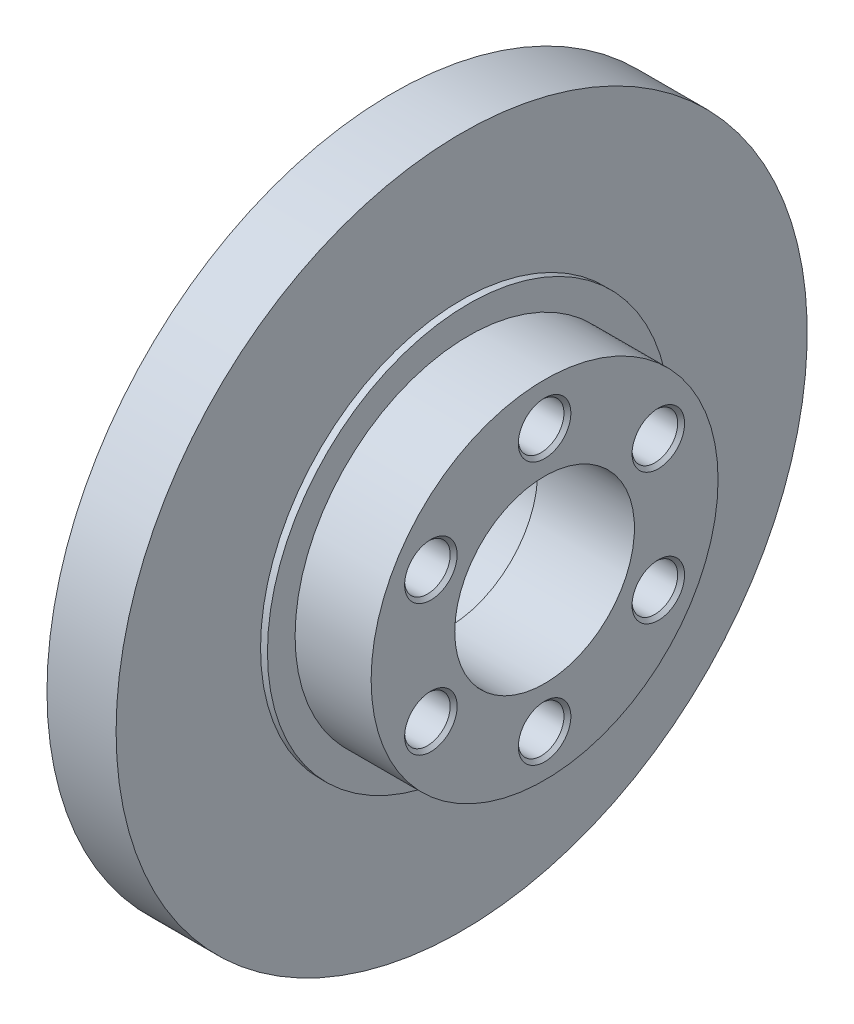
ISO-10303-21;
HEADER;
FILE_DESCRIPTION(('STEP AP214'),'2;1');
FILE_NAME('part.step','',(''),(''),'','','');
FILE_SCHEMA(('AUTOMOTIVE_DESIGN { 1 0 10303 214 1 1 1 1 }'));
ENDSEC;
DATA;
#1=APPLICATION_CONTEXT('core data for automotive mechanical design processes');
#2=APPLICATION_PROTOCOL_DEFINITION('international standard','automotive_design',2000,#1);
#3=PRODUCT_CONTEXT('',#1,'mechanical');
#4=PRODUCT('Part','Part','',(#3));
#5=PRODUCT_RELATED_PRODUCT_CATEGORY('part','',(#4));
#6=PRODUCT_DEFINITION_FORMATION('','',#4);
#7=PRODUCT_DEFINITION_CONTEXT('part definition',#1,'design');
#8=PRODUCT_DEFINITION('design','',#6,#7);
#9=PRODUCT_DEFINITION_SHAPE('','',#8);
#10=(LENGTH_UNIT() NAMED_UNIT(*) SI_UNIT(.MILLI.,.METRE.));
#11=(NAMED_UNIT(*) PLANE_ANGLE_UNIT() SI_UNIT($,.RADIAN.));
#12=(NAMED_UNIT(*) SI_UNIT($,.STERADIAN.) SOLID_ANGLE_UNIT());
#13=UNCERTAINTY_MEASURE_WITH_UNIT(LENGTH_MEASURE(1.E-05),#10,'distance_accuracy_value','');
#14=(GEOMETRIC_REPRESENTATION_CONTEXT(3) GLOBAL_UNCERTAINTY_ASSIGNED_CONTEXT((#13)) GLOBAL_UNIT_ASSIGNED_CONTEXT((#10,
#11,#12)) REPRESENTATION_CONTEXT('',''));
#15=CARTESIAN_POINT('',(0.,0.,0.));
#16=DIRECTION('',(0.,0.,1.));
#17=DIRECTION('',(1.,0.,0.));
#18=AXIS2_PLACEMENT_3D('',#15,#16,#17);
#19=CARTESIAN_POINT('',(0.,14.,0.));
#20=DIRECTION('',(1.,0.,0.));
#21=DIRECTION('',(0.,0.,-1.));
#22=AXIS2_PLACEMENT_3D('',#19,#20,#21);
#23=PLANE('',#22);
#24=CARTESIAN_POINT('',(0.,40.,0.));
#25=DIRECTION('',(1.,0.,0.));
#26=DIRECTION('',(0.,0.,-1.));
#27=AXIS2_PLACEMENT_3D('',#24,#25,#26);
#28=CIRCLE('',#27,2.5);
#29=CARTESIAN_POINT('',(0.,40.,-2.5));
#30=VERTEX_POINT('',#29);
#31=EDGE_CURVE('E158',#30,#30,#28,.T.);
#32=ORIENTED_EDGE('',*,*,#31,.T.);
#33=EDGE_LOOP('',(#32));
#34=FACE_BOUND('',#33,.T.);
#35=CARTESIAN_POINT('',(0.,28.2842712474619,-28.284271247462));
#36=DIRECTION('',(1.,0.,0.));
#37=DIRECTION('',(0.,0.,-1.));
#38=AXIS2_PLACEMENT_3D('',#35,#36,#37);
#39=CIRCLE('',#38,2.5);
#40=CARTESIAN_POINT('',(0.,28.2842712474619,-30.784271247462));
#41=VERTEX_POINT('',#40);
#42=EDGE_CURVE('E155',#41,#41,#39,.T.);
#43=ORIENTED_EDGE('',*,*,#42,.T.);
#44=EDGE_LOOP('',(#43));
#45=FACE_BOUND('',#44,.T.);
#46=CARTESIAN_POINT('',(0.,-1.39659253553725E-13,-40.));
#47=DIRECTION('',(1.,0.,0.));
#48=DIRECTION('',(0.,0.,-1.));
#49=AXIS2_PLACEMENT_3D('',#46,#47,#48);
#50=CIRCLE('',#49,2.5);
#51=CARTESIAN_POINT('',(0.,-1.39659253553725E-13,-42.5));
#52=VERTEX_POINT('',#51);
#53=EDGE_CURVE('E149',#52,#52,#50,.T.);
#54=ORIENTED_EDGE('',*,*,#53,.T.);
#55=EDGE_LOOP('',(#54));
#56=FACE_BOUND('',#55,.T.);
#57=CARTESIAN_POINT('',(0.,-28.2842712474621,-28.2842712474618));
#58=DIRECTION('',(1.,0.,0.));
#59=DIRECTION('',(0.,0.,-1.));
#60=AXIS2_PLACEMENT_3D('',#57,#58,#59);
#61=CIRCLE('',#60,2.5);
#62=CARTESIAN_POINT('',(0.,-28.2842712474621,-30.7842712474617));
#63=VERTEX_POINT('',#62);
#64=EDGE_CURVE('E143',#63,#63,#61,.T.);
#65=ORIENTED_EDGE('',*,*,#64,.T.);
#66=EDGE_LOOP('',(#65));
#67=FACE_BOUND('',#66,.T.);
#68=CARTESIAN_POINT('',(0.,-40.,2.79318507107451E-13));
#69=DIRECTION('',(1.,0.,0.));
#70=DIRECTION('',(0.,0.,-1.));
#71=AXIS2_PLACEMENT_3D('',#68,#69,#70);
#72=CIRCLE('',#71,2.5);
#73=CARTESIAN_POINT('',(0.,-40.,-2.49999999999972));
#74=VERTEX_POINT('',#73);
#75=EDGE_CURVE('E137',#74,#74,#72,.T.);
#76=ORIENTED_EDGE('',*,*,#75,.T.);
#77=EDGE_LOOP('',(#76));
#78=FACE_BOUND('',#77,.T.);
#79=CARTESIAN_POINT('',(0.,-28.2842712474617,28.2842712474621));
#80=DIRECTION('',(1.,0.,0.));
#81=DIRECTION('',(0.,0.,-1.));
#82=AXIS2_PLACEMENT_3D('',#79,#80,#81);
#83=CIRCLE('',#82,2.5);
#84=CARTESIAN_POINT('',(0.,-28.2842712474617,25.7842712474622));
#85=VERTEX_POINT('',#84);
#86=EDGE_CURVE('E131',#85,#85,#83,.T.);
#87=ORIENTED_EDGE('',*,*,#86,.T.);
#88=EDGE_LOOP('',(#87));
#89=FACE_BOUND('',#88,.T.);
#90=CARTESIAN_POINT('',(0.,4.18977760661176E-13,40.));
#91=DIRECTION('',(1.,0.,0.));
#92=DIRECTION('',(0.,0.,-1.));
#93=AXIS2_PLACEMENT_3D('',#90,#91,#92);
#94=CIRCLE('',#93,2.5);
#95=CARTESIAN_POINT('',(0.,4.18977760661176E-13,37.5));
#96=VERTEX_POINT('',#95);
#97=EDGE_CURVE('E125',#96,#96,#94,.T.);
#98=ORIENTED_EDGE('',*,*,#97,.T.);
#99=EDGE_LOOP('',(#98));
#100=FACE_BOUND('',#99,.T.);
#101=CARTESIAN_POINT('',(0.,28.2842712474622,28.2842712474616));
#102=DIRECTION('',(1.,0.,0.));
#103=DIRECTION('',(0.,0.,-1.));
#104=AXIS2_PLACEMENT_3D('',#101,#102,#103);
#105=CIRCLE('',#104,2.5);
#106=CARTESIAN_POINT('',(0.,28.2842712474622,25.7842712474616));
#107=VERTEX_POINT('',#106);
#108=EDGE_CURVE('E118',#107,#107,#105,.T.);
#109=ORIENTED_EDGE('',*,*,#108,.T.);
#110=EDGE_LOOP('',(#109));
#111=FACE_BOUND('',#110,.T.);
#112=CARTESIAN_POINT('',(0.,0.,0.));
#113=DIRECTION('',(-1.,0.,0.));
#114=DIRECTION('',(0.,0.,1.));
#115=AXIS2_PLACEMENT_3D('',#112,#113,#114);
#116=CIRCLE('',#115,14.);
#117=CARTESIAN_POINT('',(0.,0.,14.));
#118=VERTEX_POINT('',#117);
#119=EDGE_CURVE('E111',#118,#118,#116,.T.);
#120=ORIENTED_EDGE('',*,*,#119,.F.);
#121=EDGE_LOOP('',(#120));
#122=FACE_BOUND('',#121,.T.);
#123=CARTESIAN_POINT('',(0.,0.,0.));
#124=DIRECTION('',(-1.,0.,0.));
#125=DIRECTION('',(0.,0.,1.));
#126=AXIS2_PLACEMENT_3D('',#123,#124,#125);
#127=CIRCLE('',#126,50.);
#128=CARTESIAN_POINT('',(0.,0.,50.));
#129=VERTEX_POINT('',#128);
#130=EDGE_CURVE('E84',#129,#129,#127,.T.);
#131=ORIENTED_EDGE('',*,*,#130,.T.);
#132=EDGE_LOOP('',(#131));
#133=FACE_BOUND('',#132,.T.);
#134=ADVANCED_FACE('F39',(#34,#45,#56,#67,#78,#89,#100,#111,#122,#133),#23,.F.);
#135=CARTESIAN_POINT('',(0.,0.,0.));
#136=DIRECTION('',(-1.,0.,0.));
#137=DIRECTION('',(0.,0.,1.));
#138=AXIS2_PLACEMENT_3D('',#135,#136,#137);
#139=CYLINDRICAL_SURFACE('',#138,50.);
#140=ORIENTED_EDGE('',*,*,#130,.F.);
#141=EDGE_LOOP('',(#140));
#142=FACE_BOUND('',#141,.T.);
#143=CARTESIAN_POINT('',(10.,0.,0.));
#144=DIRECTION('',(-1.,0.,0.));
#145=DIRECTION('',(0.,0.,1.));
#146=AXIS2_PLACEMENT_3D('',#143,#144,#145);
#147=CIRCLE('',#146,50.);
#148=CARTESIAN_POINT('',(10.,0.,50.));
#149=VERTEX_POINT('',#148);
#150=EDGE_CURVE('E87',#149,#149,#147,.T.);
#151=ORIENTED_EDGE('',*,*,#150,.T.);
#152=EDGE_LOOP('',(#151));
#153=FACE_BOUND('',#152,.T.);
#154=ADVANCED_FACE('F200',(#142,#153),#139,.T.);
#155=CARTESIAN_POINT('',(10.,50.,0.));
#156=DIRECTION('',(-1.,0.,0.));
#157=DIRECTION('',(0.,0.,1.));
#158=AXIS2_PLACEMENT_3D('',#155,#156,#157);
#159=PLANE('',#158);
#160=ORIENTED_EDGE('',*,*,#150,.F.);
#161=EDGE_LOOP('',(#160));
#162=FACE_BOUND('',#161,.T.);
#163=CARTESIAN_POINT('',(10.,0.,0.));
#164=DIRECTION('',(-1.,0.,0.));
#165=DIRECTION('',(0.,0.,1.));
#166=AXIS2_PLACEMENT_3D('',#163,#164,#165);
#167=CIRCLE('',#166,29.1);
#168=CARTESIAN_POINT('',(10.,0.,29.1));
#169=VERTEX_POINT('',#168);
#170=EDGE_CURVE('E90',#169,#169,#167,.T.);
#171=ORIENTED_EDGE('',*,*,#170,.T.);
#172=EDGE_LOOP('',(#171));
#173=FACE_BOUND('',#172,.T.);
#174=ADVANCED_FACE('F208',(#162,#173),#159,.F.);
#175=CARTESIAN_POINT('',(0.,0.,0.));
#176=DIRECTION('',(-1.,0.,0.));
#177=DIRECTION('',(0.,0.,1.));
#178=AXIS2_PLACEMENT_3D('',#175,#176,#177);
#179=CYLINDRICAL_SURFACE('',#178,29.1);
#180=ORIENTED_EDGE('',*,*,#170,.F.);
#181=EDGE_LOOP('',(#180));
#182=FACE_BOUND('',#181,.T.);
#183=CARTESIAN_POINT('',(11.,0.,0.));
#184=DIRECTION('',(-1.,0.,0.));
#185=DIRECTION('',(0.,0.,1.));
#186=AXIS2_PLACEMENT_3D('',#183,#184,#185);
#187=CIRCLE('',#186,29.1);
#188=CARTESIAN_POINT('',(11.,0.,29.1));
#189=VERTEX_POINT('',#188);
#190=EDGE_CURVE('E93',#189,#189,#187,.T.);
#191=ORIENTED_EDGE('',*,*,#190,.T.);
#192=EDGE_LOOP('',(#191));
#193=FACE_BOUND('',#192,.T.);
#194=ADVANCED_FACE('F289',(#182,#193),#179,.T.);
#195=CARTESIAN_POINT('',(11.,29.1,0.));
#196=DIRECTION('',(-1.,0.,0.));
#197=DIRECTION('',(0.,0.,1.));
#198=AXIS2_PLACEMENT_3D('',#195,#196,#197);
#199=PLANE('',#198);
#200=ORIENTED_EDGE('',*,*,#190,.F.);
#201=EDGE_LOOP('',(#200));
#202=FACE_BOUND('',#201,.T.);
#203=CARTESIAN_POINT('',(11.,0.,0.));
#204=DIRECTION('',(-1.,0.,0.));
#205=DIRECTION('',(0.,0.,1.));
#206=AXIS2_PLACEMENT_3D('',#203,#204,#205);
#207=CIRCLE('',#206,25.1);
#208=CARTESIAN_POINT('',(11.,0.,25.1));
#209=VERTEX_POINT('',#208);
#210=EDGE_CURVE('E96',#209,#209,#207,.T.);
#211=ORIENTED_EDGE('',*,*,#210,.T.);
#212=EDGE_LOOP('',(#211));
#213=FACE_BOUND('',#212,.T.);
#214=ADVANCED_FACE('F294',(#202,#213),#199,.F.);
#215=CARTESIAN_POINT('',(0.,0.,0.));
#216=DIRECTION('',(-1.,0.,0.));
#217=DIRECTION('',(0.,0.,1.));
#218=AXIS2_PLACEMENT_3D('',#215,#216,#217);
#219=CYLINDRICAL_SURFACE('',#218,25.1);
#220=ORIENTED_EDGE('',*,*,#210,.F.);
#221=EDGE_LOOP('',(#220));
#222=FACE_BOUND('',#221,.T.);
#223=CARTESIAN_POINT('',(22.,0.,0.));
#224=DIRECTION('',(-1.,0.,0.));
#225=DIRECTION('',(0.,0.,1.));
#226=AXIS2_PLACEMENT_3D('',#223,#224,#225);
#227=CIRCLE('',#226,25.1);
#228=CARTESIAN_POINT('',(22.,0.,25.1));
#229=VERTEX_POINT('',#228);
#230=EDGE_CURVE('E99',#229,#229,#227,.T.);
#231=ORIENTED_EDGE('',*,*,#230,.T.);
#232=EDGE_LOOP('',(#231));
#233=FACE_BOUND('',#232,.T.);
#234=ADVANCED_FACE('F256',(#222,#233),#219,.T.);
#235=CARTESIAN_POINT('',(22.,25.1,0.));
#236=DIRECTION('',(-1.,0.,0.));
#237=DIRECTION('',(0.,0.,1.));
#238=AXIS2_PLACEMENT_3D('',#235,#236,#237);
#239=PLANE('',#238);
#240=CARTESIAN_POINT('',(22.,9.50000000000019,16.4544826719042));
#241=DIRECTION('',(-1.,0.,0.));
#242=DIRECTION('',(0.,0.,1.));
#243=AXIS2_PLACEMENT_3D('',#240,#241,#242);
#244=CIRCLE('',#243,3.79999999999998);
#245=CARTESIAN_POINT('',(22.,9.50000000000019,20.2544826719042));
#246=VERTEX_POINT('',#245);
#247=EDGE_CURVE('E63',#246,#246,#244,.T.);
#248=ORIENTED_EDGE('',*,*,#247,.T.);
#249=EDGE_LOOP('',(#248));
#250=FACE_BOUND('',#249,.T.);
#251=CARTESIAN_POINT('',(22.,-9.49999999999985,16.4544826719044));
#252=DIRECTION('',(-1.,0.,0.));
#253=DIRECTION('',(0.,0.,1.));
#254=AXIS2_PLACEMENT_3D('',#251,#252,#253);
#255=CIRCLE('',#254,3.79999999999998);
#256=CARTESIAN_POINT('',(22.,-9.49999999999985,20.2544826719044));
#257=VERTEX_POINT('',#256);
#258=EDGE_CURVE('E66',#257,#257,#255,.T.);
#259=ORIENTED_EDGE('',*,*,#258,.T.);
#260=EDGE_LOOP('',(#259));
#261=FACE_BOUND('',#260,.T.);
#262=CARTESIAN_POINT('',(22.,-19.,1.32676290876039E-13));
#263=DIRECTION('',(-1.,0.,0.));
#264=DIRECTION('',(0.,0.,1.));
#265=AXIS2_PLACEMENT_3D('',#262,#263,#264);
#266=CIRCLE('',#265,3.8);
#267=CARTESIAN_POINT('',(22.,-19.,3.80000000000013));
#268=VERTEX_POINT('',#267);
#269=EDGE_CURVE('E69',#268,#268,#266,.T.);
#270=ORIENTED_EDGE('',*,*,#269,.T.);
#271=EDGE_LOOP('',(#270));
#272=FACE_BOUND('',#271,.T.);
#273=CARTESIAN_POINT('',(22.,-9.50000000000008,-16.4544826719043));
#274=DIRECTION('',(-1.,0.,0.));
#275=DIRECTION('',(0.,0.,1.));
#276=AXIS2_PLACEMENT_3D('',#273,#274,#275);
#277=CIRCLE('',#276,3.79999999999998);
#278=CARTESIAN_POINT('',(22.,-9.50000000000008,-12.6544826719043));
#279=VERTEX_POINT('',#278);
#280=EDGE_CURVE('E72',#279,#279,#277,.T.);
#281=ORIENTED_EDGE('',*,*,#280,.T.);
#282=EDGE_LOOP('',(#281));
#283=FACE_BOUND('',#282,.T.);
#284=CARTESIAN_POINT('',(22.,9.49999999999996,-16.4544826719044));
#285=DIRECTION('',(-1.,0.,0.));
#286=DIRECTION('',(0.,0.,1.));
#287=AXIS2_PLACEMENT_3D('',#284,#285,#286);
#288=CIRCLE('',#287,3.79999999999998);
#289=CARTESIAN_POINT('',(22.,9.49999999999996,-12.6544826719044));
#290=VERTEX_POINT('',#289);
#291=EDGE_CURVE('E75',#290,#290,#288,.T.);
#292=ORIENTED_EDGE('',*,*,#291,.T.);
#293=EDGE_LOOP('',(#292));
#294=FACE_BOUND('',#293,.T.);
#295=CARTESIAN_POINT('',(22.,19.,0.));
#296=DIRECTION('',(-1.,0.,0.));
#297=DIRECTION('',(0.,0.,1.));
#298=AXIS2_PLACEMENT_3D('',#295,#296,#297);
#299=CIRCLE('',#298,3.8);
#300=CARTESIAN_POINT('',(22.,19.,3.8));
#301=VERTEX_POINT('',#300);
#302=EDGE_CURVE('E78',#301,#301,#299,.T.);
#303=ORIENTED_EDGE('',*,*,#302,.T.);
#304=EDGE_LOOP('',(#303));
#305=FACE_BOUND('',#304,.T.);
#306=ORIENTED_EDGE('',*,*,#230,.F.);
#307=EDGE_LOOP('',(#306));
#308=FACE_BOUND('',#307,.T.);
#309=CARTESIAN_POINT('',(22.,0.,0.));
#310=DIRECTION('',(-1.,0.,0.));
#311=DIRECTION('',(0.,0.,1.));
#312=AXIS2_PLACEMENT_3D('',#309,#310,#311);
#313=CIRCLE('',#312,13.);
#314=CARTESIAN_POINT('',(22.,0.,13.));
#315=VERTEX_POINT('',#314);
#316=EDGE_CURVE('E102',#315,#315,#313,.T.);
#317=ORIENTED_EDGE('',*,*,#316,.T.);
#318=EDGE_LOOP('',(#317));
#319=FACE_BOUND('',#318,.T.);
#320=ADVANCED_FACE('F252',(#250,#261,#272,#283,#294,#305,#308,#319),#239,.F.);
#321=CARTESIAN_POINT('',(0.,0.,0.));
#322=DIRECTION('',(-1.,0.,0.));
#323=DIRECTION('',(0.,0.,1.));
#324=AXIS2_PLACEMENT_3D('',#321,#322,#323);
#325=CYLINDRICAL_SURFACE('',#324,13.);
#326=ORIENTED_EDGE('',*,*,#316,.F.);
#327=EDGE_LOOP('',(#326));
#328=FACE_BOUND('',#327,.T.);
#329=CARTESIAN_POINT('',(8.00000000000001,0.,0.));
#330=DIRECTION('',(-1.,0.,0.));
#331=DIRECTION('',(0.,0.,1.));
#332=AXIS2_PLACEMENT_3D('',#329,#330,#331);
#333=CIRCLE('',#332,13.);
#334=CARTESIAN_POINT('',(8.00000000000001,0.,13.));
#335=VERTEX_POINT('',#334);
#336=EDGE_CURVE('E105',#335,#335,#333,.T.);
#337=ORIENTED_EDGE('',*,*,#336,.T.);
#338=EDGE_LOOP('',(#337));
#339=FACE_BOUND('',#338,.T.);
#340=ADVANCED_FACE('F255',(#328,#339),#325,.F.);
#341=CARTESIAN_POINT('',(8.00000000000001,13.,0.));
#342=DIRECTION('',(1.,0.,0.));
#343=DIRECTION('',(0.,0.,-1.));
#344=AXIS2_PLACEMENT_3D('',#341,#342,#343);
#345=PLANE('',#344);
#346=ORIENTED_EDGE('',*,*,#336,.F.);
#347=EDGE_LOOP('',(#346));
#348=FACE_BOUND('',#347,.T.);
#349=CARTESIAN_POINT('',(8.00000000000001,0.,0.));
#350=DIRECTION('',(-1.,0.,0.));
#351=DIRECTION('',(0.,0.,1.));
#352=AXIS2_PLACEMENT_3D('',#349,#350,#351);
#353=CIRCLE('',#352,14.);
#354=CARTESIAN_POINT('',(8.00000000000001,0.,14.));
#355=VERTEX_POINT('',#354);
#356=EDGE_CURVE('E108',#355,#355,#353,.T.);
#357=ORIENTED_EDGE('',*,*,#356,.T.);
#358=EDGE_LOOP('',(#357));
#359=FACE_BOUND('',#358,.T.);
#360=ADVANCED_FACE('F267',(#348,#359),#345,.F.);
#361=CARTESIAN_POINT('',(0.,0.,0.));
#362=DIRECTION('',(-1.,0.,0.));
#363=DIRECTION('',(0.,0.,1.));
#364=AXIS2_PLACEMENT_3D('',#361,#362,#363);
#365=CYLINDRICAL_SURFACE('',#364,14.);
#366=ORIENTED_EDGE('',*,*,#356,.F.);
#367=EDGE_LOOP('',(#366));
#368=FACE_BOUND('',#367,.T.);
#369=ORIENTED_EDGE('',*,*,#119,.T.);
#370=EDGE_LOOP('',(#369));
#371=FACE_BOUND('',#370,.T.);
#372=ADVANCED_FACE('F273',(#368,#371),#365,.F.);
#373=CARTESIAN_POINT('',(4.,28.2842712474622,28.2842712474616));
#374=DIRECTION('',(-1.,0.,0.));
#375=DIRECTION('',(0.,0.,1.));
#376=AXIS2_PLACEMENT_3D('',#373,#374,#375);
#377=CYLINDRICAL_SURFACE('',#376,2.5);
#378=CARTESIAN_POINT('',(4.,28.2842712474622,28.2842712474616));
#379=DIRECTION('',(1.,0.,0.));
#380=DIRECTION('',(0.,0.,-1.));
#381=AXIS2_PLACEMENT_3D('',#378,#379,#380);
#382=CIRCLE('',#381,2.5);
#383=CARTESIAN_POINT('',(4.,28.2842712474622,25.7842712474616));
#384=VERTEX_POINT('',#383);
#385=EDGE_CURVE('E115',#384,#384,#382,.T.);
#386=ORIENTED_EDGE('',*,*,#385,.T.);
#387=EDGE_LOOP('',(#386));
#388=FACE_BOUND('',#387,.T.);
#389=ORIENTED_EDGE('',*,*,#108,.F.);
#390=EDGE_LOOP('',(#389));
#391=FACE_BOUND('',#390,.T.);
#392=ADVANCED_FACE('F278',(#388,#391),#377,.F.);
#393=CARTESIAN_POINT('',(4.,28.2842712474622,28.2842712474616));
#394=DIRECTION('',(1.,0.,0.));
#395=DIRECTION('',(0.,0.,-1.));
#396=AXIS2_PLACEMENT_3D('',#393,#394,#395);
#397=PLANE('',#396);
#398=ORIENTED_EDGE('',*,*,#385,.F.);
#399=EDGE_LOOP('',(#398));
#400=FACE_BOUND('',#399,.T.);
#401=ADVANCED_FACE('F309',(#400),#397,.F.);
#402=CARTESIAN_POINT('',(4.,4.18977760661176E-13,40.));
#403=DIRECTION('',(-1.,0.,0.));
#404=DIRECTION('',(0.,0.,1.));
#405=AXIS2_PLACEMENT_3D('',#402,#403,#404);
#406=CYLINDRICAL_SURFACE('',#405,2.5);
#407=CARTESIAN_POINT('',(4.,4.18977760661176E-13,40.));
#408=DIRECTION('',(1.,0.,0.));
#409=DIRECTION('',(0.,0.,-1.));
#410=AXIS2_PLACEMENT_3D('',#407,#408,#409);
#411=CIRCLE('',#410,2.5);
#412=CARTESIAN_POINT('',(4.,4.18977760661176E-13,37.5));
#413=VERTEX_POINT('',#412);
#414=EDGE_CURVE('E122',#413,#413,#411,.T.);
#415=ORIENTED_EDGE('',*,*,#414,.T.);
#416=EDGE_LOOP('',(#415));
#417=FACE_BOUND('',#416,.T.);
#418=ORIENTED_EDGE('',*,*,#97,.F.);
#419=EDGE_LOOP('',(#418));
#420=FACE_BOUND('',#419,.T.);
#421=ADVANCED_FACE('F312',(#417,#420),#406,.F.);
#422=CARTESIAN_POINT('',(4.,4.18977760661176E-13,40.));
#423=DIRECTION('',(1.,0.,0.));
#424=DIRECTION('',(0.,0.,-1.));
#425=AXIS2_PLACEMENT_3D('',#422,#423,#424);
#426=PLANE('',#425);
#427=ORIENTED_EDGE('',*,*,#414,.F.);
#428=EDGE_LOOP('',(#427));
#429=FACE_BOUND('',#428,.T.);
#430=ADVANCED_FACE('F316',(#429),#426,.F.);
#431=CARTESIAN_POINT('',(4.,-28.2842712474617,28.2842712474621));
#432=DIRECTION('',(-1.,0.,0.));
#433=DIRECTION('',(0.,0.,1.));
#434=AXIS2_PLACEMENT_3D('',#431,#432,#433);
#435=CYLINDRICAL_SURFACE('',#434,2.5);
#436=CARTESIAN_POINT('',(4.,-28.2842712474617,28.2842712474621));
#437=DIRECTION('',(1.,0.,0.));
#438=DIRECTION('',(0.,0.,-1.));
#439=AXIS2_PLACEMENT_3D('',#436,#437,#438);
#440=CIRCLE('',#439,2.5);
#441=CARTESIAN_POINT('',(4.,-28.2842712474617,25.7842712474622));
#442=VERTEX_POINT('',#441);
#443=EDGE_CURVE('E128',#442,#442,#440,.T.);
#444=ORIENTED_EDGE('',*,*,#443,.T.);
#445=EDGE_LOOP('',(#444));
#446=FACE_BOUND('',#445,.T.);
#447=ORIENTED_EDGE('',*,*,#86,.F.);
#448=EDGE_LOOP('',(#447));
#449=FACE_BOUND('',#448,.T.);
#450=ADVANCED_FACE('F319',(#446,#449),#435,.F.);
#451=CARTESIAN_POINT('',(4.,-28.2842712474617,28.2842712474621));
#452=DIRECTION('',(1.,0.,0.));
#453=DIRECTION('',(0.,0.,-1.));
#454=AXIS2_PLACEMENT_3D('',#451,#452,#453);
#455=PLANE('',#454);
#456=ORIENTED_EDGE('',*,*,#443,.F.);
#457=EDGE_LOOP('',(#456));
#458=FACE_BOUND('',#457,.T.);
#459=ADVANCED_FACE('F324',(#458),#455,.F.);
#460=CARTESIAN_POINT('',(4.,-40.,2.79318507107451E-13));
#461=DIRECTION('',(-1.,0.,0.));
#462=DIRECTION('',(0.,0.,1.));
#463=AXIS2_PLACEMENT_3D('',#460,#461,#462);
#464=CYLINDRICAL_SURFACE('',#463,2.5);
#465=CARTESIAN_POINT('',(4.,-40.,2.79318507107451E-13));
#466=DIRECTION('',(1.,0.,0.));
#467=DIRECTION('',(0.,0.,-1.));
#468=AXIS2_PLACEMENT_3D('',#465,#466,#467);
#469=CIRCLE('',#468,2.5);
#470=CARTESIAN_POINT('',(4.,-40.,-2.49999999999972));
#471=VERTEX_POINT('',#470);
#472=EDGE_CURVE('E134',#471,#471,#469,.T.);
#473=ORIENTED_EDGE('',*,*,#472,.T.);
#474=EDGE_LOOP('',(#473));
#475=FACE_BOUND('',#474,.T.);
#476=ORIENTED_EDGE('',*,*,#75,.F.);
#477=EDGE_LOOP('',(#476));
#478=FACE_BOUND('',#477,.T.);
#479=ADVANCED_FACE('F327',(#475,#478),#464,.F.);
#480=CARTESIAN_POINT('',(4.,-40.,2.79318507107451E-13));
#481=DIRECTION('',(1.,0.,0.));
#482=DIRECTION('',(0.,0.,-1.));
#483=AXIS2_PLACEMENT_3D('',#480,#481,#482);
#484=PLANE('',#483);
#485=ORIENTED_EDGE('',*,*,#472,.F.);
#486=EDGE_LOOP('',(#485));
#487=FACE_BOUND('',#486,.T.);
#488=ADVANCED_FACE('F332',(#487),#484,.F.);
#489=CARTESIAN_POINT('',(4.,-28.2842712474621,-28.2842712474618));
#490=DIRECTION('',(-1.,0.,0.));
#491=DIRECTION('',(0.,0.,1.));
#492=AXIS2_PLACEMENT_3D('',#489,#490,#491);
#493=CYLINDRICAL_SURFACE('',#492,2.5);
#494=CARTESIAN_POINT('',(4.,-28.2842712474621,-28.2842712474618));
#495=DIRECTION('',(1.,0.,0.));
#496=DIRECTION('',(0.,0.,-1.));
#497=AXIS2_PLACEMENT_3D('',#494,#495,#496);
#498=CIRCLE('',#497,2.5);
#499=CARTESIAN_POINT('',(4.,-28.2842712474621,-30.7842712474617));
#500=VERTEX_POINT('',#499);
#501=EDGE_CURVE('E140',#500,#500,#498,.T.);
#502=ORIENTED_EDGE('',*,*,#501,.T.);
#503=EDGE_LOOP('',(#502));
#504=FACE_BOUND('',#503,.T.);
#505=ORIENTED_EDGE('',*,*,#64,.F.);
#506=EDGE_LOOP('',(#505));
#507=FACE_BOUND('',#506,.T.);
#508=ADVANCED_FACE('F335',(#504,#507),#493,.F.);
#509=CARTESIAN_POINT('',(4.,-28.2842712474621,-28.2842712474618));
#510=DIRECTION('',(1.,0.,0.));
#511=DIRECTION('',(0.,0.,-1.));
#512=AXIS2_PLACEMENT_3D('',#509,#510,#511);
#513=PLANE('',#512);
#514=ORIENTED_EDGE('',*,*,#501,.F.);
#515=EDGE_LOOP('',(#514));
#516=FACE_BOUND('',#515,.T.);
#517=ADVANCED_FACE('F340',(#516),#513,.F.);
#518=CARTESIAN_POINT('',(4.,-1.39659253553725E-13,-40.));
#519=DIRECTION('',(-1.,0.,0.));
#520=DIRECTION('',(0.,0.,1.));
#521=AXIS2_PLACEMENT_3D('',#518,#519,#520);
#522=CYLINDRICAL_SURFACE('',#521,2.5);
#523=CARTESIAN_POINT('',(4.,-1.39659253553725E-13,-40.));
#524=DIRECTION('',(1.,0.,0.));
#525=DIRECTION('',(0.,0.,-1.));
#526=AXIS2_PLACEMENT_3D('',#523,#524,#525);
#527=CIRCLE('',#526,2.5);
#528=CARTESIAN_POINT('',(4.,-1.39659253553725E-13,-42.5));
#529=VERTEX_POINT('',#528);
#530=EDGE_CURVE('E146',#529,#529,#527,.T.);
#531=ORIENTED_EDGE('',*,*,#530,.T.);
#532=EDGE_LOOP('',(#531));
#533=FACE_BOUND('',#532,.T.);
#534=ORIENTED_EDGE('',*,*,#53,.F.);
#535=EDGE_LOOP('',(#534));
#536=FACE_BOUND('',#535,.T.);
#537=ADVANCED_FACE('F343',(#533,#536),#522,.F.);
#538=CARTESIAN_POINT('',(4.,-1.39659253553725E-13,-40.));
#539=DIRECTION('',(1.,0.,0.));
#540=DIRECTION('',(0.,0.,-1.));
#541=AXIS2_PLACEMENT_3D('',#538,#539,#540);
#542=PLANE('',#541);
#543=ORIENTED_EDGE('',*,*,#530,.F.);
#544=EDGE_LOOP('',(#543));
#545=FACE_BOUND('',#544,.T.);
#546=ADVANCED_FACE('F348',(#545),#542,.F.);
#547=CARTESIAN_POINT('',(4.,28.2842712474619,-28.284271247462));
#548=DIRECTION('',(-1.,0.,0.));
#549=DIRECTION('',(0.,0.,1.));
#550=AXIS2_PLACEMENT_3D('',#547,#548,#549);
#551=CYLINDRICAL_SURFACE('',#550,2.5);
#552=CARTESIAN_POINT('',(4.,28.2842712474619,-28.284271247462));
#553=DIRECTION('',(1.,0.,0.));
#554=DIRECTION('',(0.,0.,-1.));
#555=AXIS2_PLACEMENT_3D('',#552,#553,#554);
#556=CIRCLE('',#555,2.5);
#557=CARTESIAN_POINT('',(4.,28.2842712474619,-30.784271247462));
#558=VERTEX_POINT('',#557);
#559=EDGE_CURVE('E152',#558,#558,#556,.T.);
#560=ORIENTED_EDGE('',*,*,#559,.T.);
#561=EDGE_LOOP('',(#560));
#562=FACE_BOUND('',#561,.T.);
#563=ORIENTED_EDGE('',*,*,#42,.F.);
#564=EDGE_LOOP('',(#563));
#565=FACE_BOUND('',#564,.T.);
#566=ADVANCED_FACE('F351',(#562,#565),#551,.F.);
#567=CARTESIAN_POINT('',(4.,28.2842712474619,-28.284271247462));
#568=DIRECTION('',(1.,0.,0.));
#569=DIRECTION('',(0.,0.,-1.));
#570=AXIS2_PLACEMENT_3D('',#567,#568,#569);
#571=PLANE('',#570);
#572=ORIENTED_EDGE('',*,*,#559,.F.);
#573=EDGE_LOOP('',(#572));
#574=FACE_BOUND('',#573,.T.);
#575=ADVANCED_FACE('F356',(#574),#571,.F.);
#576=CARTESIAN_POINT('',(4.,40.,0.));
#577=DIRECTION('',(-1.,0.,0.));
#578=DIRECTION('',(0.,0.,1.));
#579=AXIS2_PLACEMENT_3D('',#576,#577,#578);
#580=CYLINDRICAL_SURFACE('',#579,2.5);
#581=CARTESIAN_POINT('',(4.,40.,0.));
#582=DIRECTION('',(1.,0.,0.));
#583=DIRECTION('',(0.,0.,-1.));
#584=AXIS2_PLACEMENT_3D('',#581,#582,#583);
#585=CIRCLE('',#584,2.5);
#586=CARTESIAN_POINT('',(4.,40.,-2.5));
#587=VERTEX_POINT('',#586);
#588=EDGE_CURVE('E114',#587,#587,#585,.T.);
#589=ORIENTED_EDGE('',*,*,#588,.T.);
#590=EDGE_LOOP('',(#589));
#591=FACE_BOUND('',#590,.T.);
#592=ORIENTED_EDGE('',*,*,#31,.F.);
#593=EDGE_LOOP('',(#592));
#594=FACE_BOUND('',#593,.T.);
#595=ADVANCED_FACE('F359',(#591,#594),#580,.F.);
#596=CARTESIAN_POINT('',(4.,40.,0.));
#597=DIRECTION('',(1.,0.,0.));
#598=DIRECTION('',(0.,0.,-1.));
#599=AXIS2_PLACEMENT_3D('',#596,#597,#598);
#600=PLANE('',#599);
#601=ORIENTED_EDGE('',*,*,#588,.F.);
#602=EDGE_LOOP('',(#601));
#603=FACE_BOUND('',#602,.T.);
#604=ADVANCED_FACE('F366',(#603),#600,.F.);
#605=CARTESIAN_POINT('',(12.,9.49999999999996,-16.4544826719044));
#606=DIRECTION('',(1.,0.,0.));
#607=DIRECTION('',(0.,0.,-1.));
#608=AXIS2_PLACEMENT_3D('',#605,#606,#607);
#609=CYLINDRICAL_SURFACE('',#608,3.3);
#610=CARTESIAN_POINT('',(21.5,9.49999999999996,-16.4544826719044));
#611=DIRECTION('',(-1.,0.,0.));
#612=DIRECTION('',(0.,0.,1.));
#613=AXIS2_PLACEMENT_3D('',#610,#611,#612);
#614=CIRCLE('',#613,3.3);
#615=CARTESIAN_POINT('',(21.5,9.49999999999996,-13.1544826719044));
#616=VERTEX_POINT('',#615);
#617=EDGE_CURVE('E47',#616,#616,#614,.F.);
#618=ORIENTED_EDGE('',*,*,#617,.T.);
#619=EDGE_LOOP('',(#618));
#620=FACE_BOUND('',#619,.T.);
#621=CARTESIAN_POINT('',(12.,9.49999999999996,-16.4544826719044));
#622=DIRECTION('',(1.,0.,0.));
#623=DIRECTION('',(0.,0.,-1.));
#624=AXIS2_PLACEMENT_3D('',#621,#622,#623);
#625=CIRCLE('',#624,3.3);
#626=CARTESIAN_POINT('',(12.,9.49999999999996,-19.7544826719044));
#627=VERTEX_POINT('',#626);
#628=EDGE_CURVE('E173',#627,#627,#625,.T.);
#629=ORIENTED_EDGE('',*,*,#628,.F.);
#630=EDGE_LOOP('',(#629));
#631=FACE_BOUND('',#630,.T.);
#632=ADVANCED_FACE('F370',(#620,#631),#609,.F.);
#633=CARTESIAN_POINT('',(12.,9.49999999999996,-16.4544826719044));
#634=DIRECTION('',(1.,0.,0.));
#635=DIRECTION('',(0.,0.,-1.));
#636=AXIS2_PLACEMENT_3D('',#633,#634,#635);
#637=PLANE('',#636);
#638=ORIENTED_EDGE('',*,*,#628,.T.);
#639=EDGE_LOOP('',(#638));
#640=FACE_BOUND('',#639,.T.);
#641=ADVANCED_FACE('F395',(#640),#637,.T.);
#642=CARTESIAN_POINT('',(12.,-9.50000000000008,-16.4544826719043));
#643=DIRECTION('',(1.,0.,0.));
#644=DIRECTION('',(0.,0.,-1.));
#645=AXIS2_PLACEMENT_3D('',#642,#643,#644);
#646=CYLINDRICAL_SURFACE('',#645,3.3);
#647=CARTESIAN_POINT('',(21.5,-9.50000000000008,-16.4544826719043));
#648=DIRECTION('',(-1.,0.,0.));
#649=DIRECTION('',(0.,0.,1.));
#650=AXIS2_PLACEMENT_3D('',#647,#648,#649);
#651=CIRCLE('',#650,3.3);
#652=CARTESIAN_POINT('',(21.5,-9.50000000000008,-13.1544826719043));
#653=VERTEX_POINT('',#652);
#654=EDGE_CURVE('E51',#653,#653,#651,.F.);
#655=ORIENTED_EDGE('',*,*,#654,.T.);
#656=EDGE_LOOP('',(#655));
#657=FACE_BOUND('',#656,.T.);
#658=CARTESIAN_POINT('',(12.,-9.50000000000008,-16.4544826719043));
#659=DIRECTION('',(1.,0.,0.));
#660=DIRECTION('',(0.,0.,-1.));
#661=AXIS2_PLACEMENT_3D('',#658,#659,#660);
#662=CIRCLE('',#661,3.3);
#663=CARTESIAN_POINT('',(12.,-9.50000000000008,-19.7544826719043));
#664=VERTEX_POINT('',#663);
#665=EDGE_CURVE('E170',#664,#664,#662,.T.);
#666=ORIENTED_EDGE('',*,*,#665,.F.);
#667=EDGE_LOOP('',(#666));
#668=FACE_BOUND('',#667,.T.);
#669=ADVANCED_FACE('F391',(#657,#668),#646,.F.);
#670=CARTESIAN_POINT('',(12.,-9.50000000000008,-16.4544826719043));
#671=DIRECTION('',(1.,0.,0.));
#672=DIRECTION('',(0.,0.,-1.));
#673=AXIS2_PLACEMENT_3D('',#670,#671,#672);
#674=PLANE('',#673);
#675=ORIENTED_EDGE('',*,*,#665,.T.);
#676=EDGE_LOOP('',(#675));
#677=FACE_BOUND('',#676,.T.);
#678=ADVANCED_FACE('F387',(#677),#674,.T.);
#679=CARTESIAN_POINT('',(12.,-19.,1.32676290876039E-13));
#680=DIRECTION('',(1.,0.,0.));
#681=DIRECTION('',(0.,0.,-1.));
#682=AXIS2_PLACEMENT_3D('',#679,#680,#681);
#683=CYLINDRICAL_SURFACE('',#682,3.3);
#684=CARTESIAN_POINT('',(21.5,-19.,1.32676290876039E-13));
#685=DIRECTION('',(-1.,0.,0.));
#686=DIRECTION('',(0.,0.,1.));
#687=AXIS2_PLACEMENT_3D('',#684,#685,#686);
#688=CIRCLE('',#687,3.3);
#689=CARTESIAN_POINT('',(21.5,-19.,3.30000000000013));
#690=VERTEX_POINT('',#689);
#691=EDGE_CURVE('E55',#690,#690,#688,.F.);
#692=ORIENTED_EDGE('',*,*,#691,.T.);
#693=EDGE_LOOP('',(#692));
#694=FACE_BOUND('',#693,.T.);
#695=CARTESIAN_POINT('',(12.,-19.,1.32676290876039E-13));
#696=DIRECTION('',(1.,0.,0.));
#697=DIRECTION('',(0.,0.,-1.));
#698=AXIS2_PLACEMENT_3D('',#695,#696,#697);
#699=CIRCLE('',#698,3.3);
#700=CARTESIAN_POINT('',(12.,-19.,-3.29999999999987));
#701=VERTEX_POINT('',#700);
#702=EDGE_CURVE('E166',#701,#701,#699,.T.);
#703=ORIENTED_EDGE('',*,*,#702,.F.);
#704=EDGE_LOOP('',(#703));
#705=FACE_BOUND('',#704,.T.);
#706=ADVANCED_FACE('F383',(#694,#705),#683,.F.);
#707=CARTESIAN_POINT('',(12.,-19.,1.32676290876039E-13));
#708=DIRECTION('',(1.,0.,0.));
#709=DIRECTION('',(0.,0.,-1.));
#710=AXIS2_PLACEMENT_3D('',#707,#708,#709);
#711=PLANE('',#710);
#712=ORIENTED_EDGE('',*,*,#702,.T.);
#713=EDGE_LOOP('',(#712));
#714=FACE_BOUND('',#713,.T.);
#715=ADVANCED_FACE('F379',(#714),#711,.T.);
#716=CARTESIAN_POINT('',(12.,-9.49999999999985,16.4544826719044));
#717=DIRECTION('',(1.,0.,0.));
#718=DIRECTION('',(0.,0.,-1.));
#719=AXIS2_PLACEMENT_3D('',#716,#717,#718);
#720=CYLINDRICAL_SURFACE('',#719,3.3);
#721=CARTESIAN_POINT('',(21.5,-9.49999999999985,16.4544826719044));
#722=DIRECTION('',(-1.,0.,0.));
#723=DIRECTION('',(0.,0.,1.));
#724=AXIS2_PLACEMENT_3D('',#721,#722,#723);
#725=CIRCLE('',#724,3.3);
#726=CARTESIAN_POINT('',(21.5,-9.49999999999985,19.7544826719044));
#727=VERTEX_POINT('',#726);
#728=EDGE_CURVE('E60',#727,#727,#725,.F.);
#729=ORIENTED_EDGE('',*,*,#728,.T.);
#730=EDGE_LOOP('',(#729));
#731=FACE_BOUND('',#730,.T.);
#732=CARTESIAN_POINT('',(12.,-9.49999999999985,16.4544826719044));
#733=DIRECTION('',(1.,0.,0.));
#734=DIRECTION('',(0.,0.,-1.));
#735=AXIS2_PLACEMENT_3D('',#732,#733,#734);
#736=CIRCLE('',#735,3.3);
#737=CARTESIAN_POINT('',(12.,-9.49999999999985,13.1544826719044));
#738=VERTEX_POINT('',#737);
#739=EDGE_CURVE('E163',#738,#738,#736,.T.);
#740=ORIENTED_EDGE('',*,*,#739,.F.);
#741=EDGE_LOOP('',(#740));
#742=FACE_BOUND('',#741,.T.);
#743=ADVANCED_FACE('F375',(#731,#742),#720,.F.);
#744=CARTESIAN_POINT('',(12.,-9.49999999999985,16.4544826719044));
#745=DIRECTION('',(1.,0.,0.));
#746=DIRECTION('',(0.,0.,-1.));
#747=AXIS2_PLACEMENT_3D('',#744,#745,#746);
#748=PLANE('',#747);
#749=ORIENTED_EDGE('',*,*,#739,.T.);
#750=EDGE_LOOP('',(#749));
#751=FACE_BOUND('',#750,.T.);
#752=ADVANCED_FACE('F372',(#751),#748,.T.);
#753=CARTESIAN_POINT('',(12.,9.50000000000019,16.4544826719042));
#754=DIRECTION('',(1.,0.,0.));
#755=DIRECTION('',(0.,0.,-1.));
#756=AXIS2_PLACEMENT_3D('',#753,#754,#755);
#757=CYLINDRICAL_SURFACE('',#756,3.3);
#758=CARTESIAN_POINT('',(21.5,9.50000000000019,16.4544826719042));
#759=DIRECTION('',(-1.,0.,0.));
#760=DIRECTION('',(0.,0.,1.));
#761=AXIS2_PLACEMENT_3D('',#758,#759,#760);
#762=CIRCLE('',#761,3.3);
#763=CARTESIAN_POINT('',(21.5,9.50000000000019,19.7544826719042));
#764=VERTEX_POINT('',#763);
#765=EDGE_CURVE('E81',#764,#764,#762,.F.);
#766=ORIENTED_EDGE('',*,*,#765,.T.);
#767=EDGE_LOOP('',(#766));
#768=FACE_BOUND('',#767,.T.);
#769=CARTESIAN_POINT('',(12.,9.50000000000019,16.4544826719042));
#770=DIRECTION('',(1.,0.,0.));
#771=DIRECTION('',(0.,0.,-1.));
#772=AXIS2_PLACEMENT_3D('',#769,#770,#771);
#773=CIRCLE('',#772,3.3);
#774=CARTESIAN_POINT('',(12.,9.50000000000019,13.1544826719042));
#775=VERTEX_POINT('',#774);
#776=EDGE_CURVE('E167',#775,#775,#773,.T.);
#777=ORIENTED_EDGE('',*,*,#776,.F.);
#778=EDGE_LOOP('',(#777));
#779=FACE_BOUND('',#778,.T.);
#780=ADVANCED_FACE('F195',(#768,#779),#757,.F.);
#781=CARTESIAN_POINT('',(12.,9.50000000000019,16.4544826719042));
#782=DIRECTION('',(1.,0.,0.));
#783=DIRECTION('',(0.,0.,-1.));
#784=AXIS2_PLACEMENT_3D('',#781,#782,#783);
#785=PLANE('',#784);
#786=ORIENTED_EDGE('',*,*,#776,.T.);
#787=EDGE_LOOP('',(#786));
#788=FACE_BOUND('',#787,.T.);
#789=ADVANCED_FACE('F185',(#788),#785,.T.);
#790=CARTESIAN_POINT('',(12.,19.,0.));
#791=DIRECTION('',(1.,0.,0.));
#792=DIRECTION('',(0.,0.,-1.));
#793=AXIS2_PLACEMENT_3D('',#790,#791,#792);
#794=CYLINDRICAL_SURFACE('',#793,3.3);
#795=CARTESIAN_POINT('',(21.5,19.,0.));
#796=DIRECTION('',(-1.,0.,0.));
#797=DIRECTION('',(0.,0.,1.));
#798=AXIS2_PLACEMENT_3D('',#795,#796,#797);
#799=CIRCLE('',#798,3.3);
#800=CARTESIAN_POINT('',(21.5,19.,3.3));
#801=VERTEX_POINT('',#800);
#802=EDGE_CURVE('E10',#801,#801,#799,.F.);
#803=ORIENTED_EDGE('',*,*,#802,.T.);
#804=EDGE_LOOP('',(#803));
#805=FACE_BOUND('',#804,.T.);
#806=CARTESIAN_POINT('',(12.,19.,0.));
#807=DIRECTION('',(1.,0.,0.));
#808=DIRECTION('',(0.,0.,-1.));
#809=AXIS2_PLACEMENT_3D('',#806,#807,#808);
#810=CIRCLE('',#809,3.3);
#811=CARTESIAN_POINT('',(12.,19.,-3.3));
#812=VERTEX_POINT('',#811);
#813=EDGE_CURVE('E119',#812,#812,#810,.T.);
#814=ORIENTED_EDGE('',*,*,#813,.F.);
#815=EDGE_LOOP('',(#814));
#816=FACE_BOUND('',#815,.T.);
#817=ADVANCED_FACE('F183',(#805,#816),#794,.F.);
#818=CARTESIAN_POINT('',(12.,19.,0.));
#819=DIRECTION('',(1.,0.,0.));
#820=DIRECTION('',(0.,0.,-1.));
#821=AXIS2_PLACEMENT_3D('',#818,#819,#820);
#822=PLANE('',#821);
#823=ORIENTED_EDGE('',*,*,#813,.T.);
#824=EDGE_LOOP('',(#823));
#825=FACE_BOUND('',#824,.T.);
#826=ADVANCED_FACE('F181',(#825),#822,.T.);
#827=CARTESIAN_POINT('',(21.5,9.50000000000019,16.4544826719042));
#828=DIRECTION('',(1.,0.,0.));
#829=DIRECTION('',(0.,0.,-1.));
#830=AXIS2_PLACEMENT_3D('',#827,#828,#829);
#831=CONICAL_SURFACE('',#830,3.3,0.785398163397469);
#832=ORIENTED_EDGE('',*,*,#247,.F.);
#833=EDGE_LOOP('',(#832));
#834=FACE_BOUND('',#833,.T.);
#835=ORIENTED_EDGE('',*,*,#765,.F.);
#836=EDGE_LOOP('',(#835));
#837=FACE_BOUND('',#836,.T.);
#838=ADVANCED_FACE('F192',(#834,#837),#831,.F.);
#839=CARTESIAN_POINT('',(21.5,-9.49999999999985,16.4544826719044));
#840=DIRECTION('',(1.,0.,0.));
#841=DIRECTION('',(0.,0.,-1.));
#842=AXIS2_PLACEMENT_3D('',#839,#840,#841);
#843=CONICAL_SURFACE('',#842,3.3,0.785398163397469);
#844=ORIENTED_EDGE('',*,*,#258,.F.);
#845=EDGE_LOOP('',(#844));
#846=FACE_BOUND('',#845,.T.);
#847=ORIENTED_EDGE('',*,*,#728,.F.);
#848=EDGE_LOOP('',(#847));
#849=FACE_BOUND('',#848,.T.);
#850=ADVANCED_FACE('F219',(#846,#849),#843,.F.);
#851=CARTESIAN_POINT('',(21.5,-19.,1.32676290876039E-13));
#852=DIRECTION('',(1.,0.,0.));
#853=DIRECTION('',(0.,0.,-1.));
#854=AXIS2_PLACEMENT_3D('',#851,#852,#853);
#855=CONICAL_SURFACE('',#854,3.3,0.785398163397456);
#856=ORIENTED_EDGE('',*,*,#269,.F.);
#857=EDGE_LOOP('',(#856));
#858=FACE_BOUND('',#857,.T.);
#859=ORIENTED_EDGE('',*,*,#691,.F.);
#860=EDGE_LOOP('',(#859));
#861=FACE_BOUND('',#860,.T.);
#862=ADVANCED_FACE('F226',(#858,#861),#855,.F.);
#863=CARTESIAN_POINT('',(21.5,-9.50000000000008,-16.4544826719043));
#864=DIRECTION('',(1.,0.,0.));
#865=DIRECTION('',(0.,0.,-1.));
#866=AXIS2_PLACEMENT_3D('',#863,#864,#865);
#867=CONICAL_SURFACE('',#866,3.3,0.785398163397469);
#868=ORIENTED_EDGE('',*,*,#280,.F.);
#869=EDGE_LOOP('',(#868));
#870=FACE_BOUND('',#869,.T.);
#871=ORIENTED_EDGE('',*,*,#654,.F.);
#872=EDGE_LOOP('',(#871));
#873=FACE_BOUND('',#872,.T.);
#874=ADVANCED_FACE('F233',(#870,#873),#867,.F.);
#875=CARTESIAN_POINT('',(21.5,9.49999999999996,-16.4544826719044));
#876=DIRECTION('',(1.,0.,0.));
#877=DIRECTION('',(0.,0.,-1.));
#878=AXIS2_PLACEMENT_3D('',#875,#876,#877);
#879=CONICAL_SURFACE('',#878,3.3,0.785398163397469);
#880=ORIENTED_EDGE('',*,*,#291,.F.);
#881=EDGE_LOOP('',(#880));
#882=FACE_BOUND('',#881,.T.);
#883=ORIENTED_EDGE('',*,*,#617,.F.);
#884=EDGE_LOOP('',(#883));
#885=FACE_BOUND('',#884,.T.);
#886=ADVANCED_FACE('F239',(#882,#885),#879,.F.);
#887=CARTESIAN_POINT('',(21.5,19.,0.));
#888=DIRECTION('',(1.,0.,0.));
#889=DIRECTION('',(0.,0.,-1.));
#890=AXIS2_PLACEMENT_3D('',#887,#888,#889);
#891=CONICAL_SURFACE('',#890,3.3,0.785398163397456);
#892=ORIENTED_EDGE('',*,*,#302,.F.);
#893=EDGE_LOOP('',(#892));
#894=FACE_BOUND('',#893,.T.);
#895=ORIENTED_EDGE('',*,*,#802,.F.);
#896=EDGE_LOOP('',(#895));
#897=FACE_BOUND('',#896,.T.);
#898=ADVANCED_FACE('F42',(#894,#897),#891,.F.);
#899=CLOSED_SHELL('',(#134,#154,#174,#194,#214,#234,#320,#340,#360,#372,#392,#401,#421,#430,
#450,#459,#479,#488,#508,#517,#537,#546,#566,#575,#595,#604,#632,#641,#669,#678,#706,#715,#743,
#752,#780,#789,#817,#826,#838,#850,#862,#874,#886,#898));
#900=MANIFOLD_SOLID_BREP('B2',#899);
#901=ADVANCED_BREP_SHAPE_REPRESENTATION('',(#18,#900),#14);
#902=SHAPE_DEFINITION_REPRESENTATION(#9,#901);
ENDSEC;
END-ISO-10303-21;
